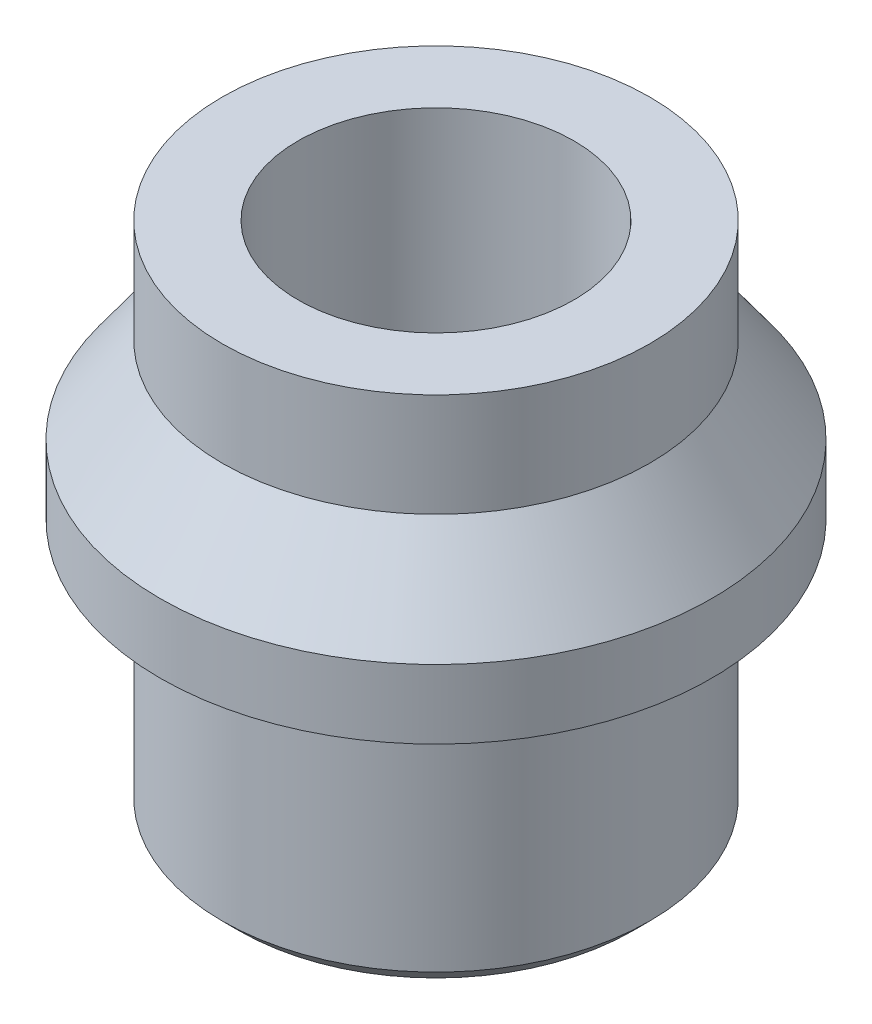
ISO-10303-21;
HEADER;
FILE_DESCRIPTION(('STEP AP214'),'2;1');
FILE_NAME('part.step','',(''),(''),'','','');
FILE_SCHEMA(('AUTOMOTIVE_DESIGN { 1 0 10303 214 1 1 1 1 }'));
ENDSEC;
DATA;
#1=APPLICATION_CONTEXT('core data for automotive mechanical design processes');
#2=APPLICATION_PROTOCOL_DEFINITION('international standard','automotive_design',2000,#1);
#3=PRODUCT_CONTEXT('',#1,'mechanical');
#4=PRODUCT('Part','Part','',(#3));
#5=PRODUCT_RELATED_PRODUCT_CATEGORY('part','',(#4));
#6=PRODUCT_DEFINITION_FORMATION('','',#4);
#7=PRODUCT_DEFINITION_CONTEXT('part definition',#1,'design');
#8=PRODUCT_DEFINITION('design','',#6,#7);
#9=PRODUCT_DEFINITION_SHAPE('','',#8);
#10=(LENGTH_UNIT() NAMED_UNIT(*) SI_UNIT(.MILLI.,.METRE.));
#11=(NAMED_UNIT(*) PLANE_ANGLE_UNIT() SI_UNIT($,.RADIAN.));
#12=(NAMED_UNIT(*) SI_UNIT($,.STERADIAN.) SOLID_ANGLE_UNIT());
#13=UNCERTAINTY_MEASURE_WITH_UNIT(LENGTH_MEASURE(1.E-05),#10,'distance_accuracy_value','');
#14=(GEOMETRIC_REPRESENTATION_CONTEXT(3) GLOBAL_UNCERTAINTY_ASSIGNED_CONTEXT((#13)) GLOBAL_UNIT_ASSIGNED_CONTEXT((#10,
#11,#12)) REPRESENTATION_CONTEXT('',''));
#15=CARTESIAN_POINT('',(0.,0.,0.));
#16=DIRECTION('',(0.,0.,1.));
#17=DIRECTION('',(1.,0.,0.));
#18=AXIS2_PLACEMENT_3D('',#15,#16,#17);
#19=CARTESIAN_POINT('',(0.,0.,0.));
#20=DIRECTION('',(0.,-1.,0.));
#21=DIRECTION('',(0.,0.,-1.));
#22=AXIS2_PLACEMENT_3D('',#19,#20,#21);
#23=CYLINDRICAL_SURFACE('',#22,4.);
#24=CARTESIAN_POINT('',(0.,0.500000000000003,0.));
#25=DIRECTION('',(0.,-1.,0.));
#26=DIRECTION('',(0.,0.,-1.));
#27=AXIS2_PLACEMENT_3D('',#24,#25,#26);
#28=CIRCLE('',#27,4.);
#29=CARTESIAN_POINT('',(0.,0.500000000000003,-4.));
#30=VERTEX_POINT('',#29);
#31=EDGE_CURVE('E49',#30,#30,#28,.T.);
#32=ORIENTED_EDGE('',*,*,#31,.T.);
#33=EDGE_LOOP('',(#32));
#34=FACE_BOUND('',#33,.T.);
#35=CARTESIAN_POINT('',(0.,15.,0.));
#36=DIRECTION('',(0.,-1.,0.));
#37=DIRECTION('',(0.,0.,-1.));
#38=AXIS2_PLACEMENT_3D('',#35,#36,#37);
#39=CIRCLE('',#38,4.);
#40=CARTESIAN_POINT('',(0.,15.,-4.));
#41=VERTEX_POINT('',#40);
#42=EDGE_CURVE('E69',#41,#41,#39,.T.);
#43=ORIENTED_EDGE('',*,*,#42,.F.);
#44=EDGE_LOOP('',(#43));
#45=FACE_BOUND('',#44,.T.);
#46=ADVANCED_FACE('F34',(#34,#45),#23,.F.);
#47=CARTESIAN_POINT('',(4.,0.,0.));
#48=DIRECTION('',(0.,-1.,0.));
#49=DIRECTION('',(0.,0.,-1.));
#50=AXIS2_PLACEMENT_3D('',#47,#48,#49);
#51=PLANE('',#50);
#52=CARTESIAN_POINT('',(0.,0.,0.));
#53=DIRECTION('',(0.,-1.,0.));
#54=DIRECTION('',(0.,0.,-1.));
#55=AXIS2_PLACEMENT_3D('',#52,#53,#54);
#56=CIRCLE('',#55,4.5);
#57=CARTESIAN_POINT('',(0.,0.,-4.5));
#58=VERTEX_POINT('',#57);
#59=EDGE_CURVE('E41',#58,#58,#56,.F.);
#60=ORIENTED_EDGE('',*,*,#59,.T.);
#61=EDGE_LOOP('',(#60));
#62=FACE_BOUND('',#61,.T.);
#63=CARTESIAN_POINT('',(0.,0.,0.));
#64=DIRECTION('',(0.,-1.,0.));
#65=DIRECTION('',(0.,0.,-1.));
#66=AXIS2_PLACEMENT_3D('',#63,#64,#65);
#67=CIRCLE('',#66,5.69999999999999);
#68=CARTESIAN_POINT('',(0.,0.,-5.69999999999999));
#69=VERTEX_POINT('',#68);
#70=EDGE_CURVE('E45',#69,#69,#67,.T.);
#71=ORIENTED_EDGE('',*,*,#70,.T.);
#72=EDGE_LOOP('',(#71));
#73=FACE_BOUND('',#72,.T.);
#74=ADVANCED_FACE('F77',(#62,#73),#51,.T.);
#75=CARTESIAN_POINT('',(0.,0.,0.));
#76=DIRECTION('',(0.,-1.,0.));
#77=DIRECTION('',(0.,0.,-1.));
#78=AXIS2_PLACEMENT_3D('',#75,#76,#77);
#79=CYLINDRICAL_SURFACE('',#78,6.2);
#80=CARTESIAN_POINT('',(0.,0.500000000000008,0.));
#81=DIRECTION('',(0.,-1.,0.));
#82=DIRECTION('',(0.,0.,-1.));
#83=AXIS2_PLACEMENT_3D('',#80,#81,#82);
#84=CIRCLE('',#83,6.2);
#85=CARTESIAN_POINT('',(0.,0.500000000000008,-6.2));
#86=VERTEX_POINT('',#85);
#87=EDGE_CURVE('E10',#86,#86,#84,.F.);
#88=ORIENTED_EDGE('',*,*,#87,.T.);
#89=EDGE_LOOP('',(#88));
#90=FACE_BOUND('',#89,.T.);
#91=CARTESIAN_POINT('',(0.,7.5,0.));
#92=DIRECTION('',(0.,-1.,0.));
#93=DIRECTION('',(0.,0.,-1.));
#94=AXIS2_PLACEMENT_3D('',#91,#92,#93);
#95=CIRCLE('',#94,6.2);
#96=CARTESIAN_POINT('',(0.,7.5,-6.2));
#97=VERTEX_POINT('',#96);
#98=EDGE_CURVE('E54',#97,#97,#95,.T.);
#99=ORIENTED_EDGE('',*,*,#98,.T.);
#100=EDGE_LOOP('',(#99));
#101=FACE_BOUND('',#100,.T.);
#102=ADVANCED_FACE('F83',(#90,#101),#79,.T.);
#103=CARTESIAN_POINT('',(6.2,7.5,0.));
#104=DIRECTION('',(0.,-1.,0.));
#105=DIRECTION('',(0.,0.,-1.));
#106=AXIS2_PLACEMENT_3D('',#103,#104,#105);
#107=PLANE('',#106);
#108=CARTESIAN_POINT('',(0.,7.5,0.));
#109=DIRECTION('',(0.,-1.,0.));
#110=DIRECTION('',(0.,0.,-1.));
#111=AXIS2_PLACEMENT_3D('',#108,#109,#110);
#112=CIRCLE('',#111,8.);
#113=CARTESIAN_POINT('',(0.,7.5,-8.));
#114=VERTEX_POINT('',#113);
#115=EDGE_CURVE('E57',#114,#114,#112,.T.);
#116=ORIENTED_EDGE('',*,*,#115,.T.);
#117=EDGE_LOOP('',(#116));
#118=FACE_BOUND('',#117,.T.);
#119=ORIENTED_EDGE('',*,*,#98,.F.);
#120=EDGE_LOOP('',(#119));
#121=FACE_BOUND('',#120,.T.);
#122=ADVANCED_FACE('F111',(#118,#121),#107,.T.);
#123=CARTESIAN_POINT('',(0.,0.,0.));
#124=DIRECTION('',(0.,-1.,0.));
#125=DIRECTION('',(0.,0.,-1.));
#126=AXIS2_PLACEMENT_3D('',#123,#124,#125);
#127=CYLINDRICAL_SURFACE('',#126,8.);
#128=CARTESIAN_POINT('',(0.,9.5,0.));
#129=DIRECTION('',(0.,-1.,0.));
#130=DIRECTION('',(0.,0.,-1.));
#131=AXIS2_PLACEMENT_3D('',#128,#129,#130);
#132=CIRCLE('',#131,8.);
#133=CARTESIAN_POINT('',(0.,9.5,-8.));
#134=VERTEX_POINT('',#133);
#135=EDGE_CURVE('E60',#134,#134,#132,.T.);
#136=ORIENTED_EDGE('',*,*,#135,.T.);
#137=EDGE_LOOP('',(#136));
#138=FACE_BOUND('',#137,.T.);
#139=ORIENTED_EDGE('',*,*,#115,.F.);
#140=EDGE_LOOP('',(#139));
#141=FACE_BOUND('',#140,.T.);
#142=ADVANCED_FACE('F107',(#138,#141),#127,.T.);
#143=CARTESIAN_POINT('',(0.,9.5,0.));
#144=DIRECTION('',(0.,-1.,0.));
#145=DIRECTION('',(0.,0.,-1.));
#146=AXIS2_PLACEMENT_3D('',#143,#144,#145);
#147=CONICAL_SURFACE('',#146,8.,0.624023052976757);
#148=CARTESIAN_POINT('',(0.,12.,0.));
#149=DIRECTION('',(0.,-1.,0.));
#150=DIRECTION('',(0.,0.,-1.));
#151=AXIS2_PLACEMENT_3D('',#148,#149,#150);
#152=CIRCLE('',#151,6.2);
#153=CARTESIAN_POINT('',(0.,12.,-6.2));
#154=VERTEX_POINT('',#153);
#155=EDGE_CURVE('E63',#154,#154,#152,.T.);
#156=ORIENTED_EDGE('',*,*,#155,.T.);
#157=EDGE_LOOP('',(#156));
#158=FACE_BOUND('',#157,.T.);
#159=ORIENTED_EDGE('',*,*,#135,.F.);
#160=EDGE_LOOP('',(#159));
#161=FACE_BOUND('',#160,.T.);
#162=ADVANCED_FACE('F101',(#158,#161),#147,.T.);
#163=CARTESIAN_POINT('',(0.,0.,0.));
#164=DIRECTION('',(0.,-1.,0.));
#165=DIRECTION('',(0.,0.,-1.));
#166=AXIS2_PLACEMENT_3D('',#163,#164,#165);
#167=CYLINDRICAL_SURFACE('',#166,6.2);
#168=CARTESIAN_POINT('',(0.,15.,0.));
#169=DIRECTION('',(0.,-1.,0.));
#170=DIRECTION('',(0.,0.,-1.));
#171=AXIS2_PLACEMENT_3D('',#168,#169,#170);
#172=CIRCLE('',#171,6.2);
#173=CARTESIAN_POINT('',(0.,15.,-6.2));
#174=VERTEX_POINT('',#173);
#175=EDGE_CURVE('E66',#174,#174,#172,.T.);
#176=ORIENTED_EDGE('',*,*,#175,.T.);
#177=EDGE_LOOP('',(#176));
#178=FACE_BOUND('',#177,.T.);
#179=ORIENTED_EDGE('',*,*,#155,.F.);
#180=EDGE_LOOP('',(#179));
#181=FACE_BOUND('',#180,.T.);
#182=ADVANCED_FACE('F94',(#178,#181),#167,.T.);
#183=CARTESIAN_POINT('',(6.2,15.,0.));
#184=DIRECTION('',(0.,1.,0.));
#185=DIRECTION('',(0.,0.,1.));
#186=AXIS2_PLACEMENT_3D('',#183,#184,#185);
#187=PLANE('',#186);
#188=ORIENTED_EDGE('',*,*,#42,.T.);
#189=EDGE_LOOP('',(#188));
#190=FACE_BOUND('',#189,.T.);
#191=ORIENTED_EDGE('',*,*,#175,.F.);
#192=EDGE_LOOP('',(#191));
#193=FACE_BOUND('',#192,.T.);
#194=ADVANCED_FACE('F73',(#190,#193),#187,.T.);
#195=CARTESIAN_POINT('',(0.,0.500000000000003,0.));
#196=DIRECTION('',(0.,-1.,0.));
#197=DIRECTION('',(0.,0.,-1.));
#198=AXIS2_PLACEMENT_3D('',#195,#196,#197);
#199=CONICAL_SURFACE('',#198,4.,0.785398163397448);
#200=ORIENTED_EDGE('',*,*,#59,.F.);
#201=EDGE_LOOP('',(#200));
#202=FACE_BOUND('',#201,.T.);
#203=ORIENTED_EDGE('',*,*,#31,.F.);
#204=EDGE_LOOP('',(#203));
#205=FACE_BOUND('',#204,.T.);
#206=ADVANCED_FACE('F86',(#202,#205),#199,.F.);
#207=CARTESIAN_POINT('',(0.,0.,0.));
#208=DIRECTION('',(0.,1.,0.));
#209=DIRECTION('',(0.,0.,1.));
#210=AXIS2_PLACEMENT_3D('',#207,#208,#209);
#211=CONICAL_SURFACE('',#210,5.69999999999999,0.785398163397447);
#212=ORIENTED_EDGE('',*,*,#87,.F.);
#213=EDGE_LOOP('',(#212));
#214=FACE_BOUND('',#213,.T.);
#215=ORIENTED_EDGE('',*,*,#70,.F.);
#216=EDGE_LOOP('',(#215));
#217=FACE_BOUND('',#216,.T.);
#218=ADVANCED_FACE('F36',(#214,#217),#211,.T.);
#219=CLOSED_SHELL('',(#46,#74,#102,#122,#142,#162,#182,#194,#206,#218));
#220=MANIFOLD_SOLID_BREP('B2',#219);
#221=ADVANCED_BREP_SHAPE_REPRESENTATION('',(#18,#220),#14);
#222=SHAPE_DEFINITION_REPRESENTATION(#9,#221);
ENDSEC;
END-ISO-10303-21;
